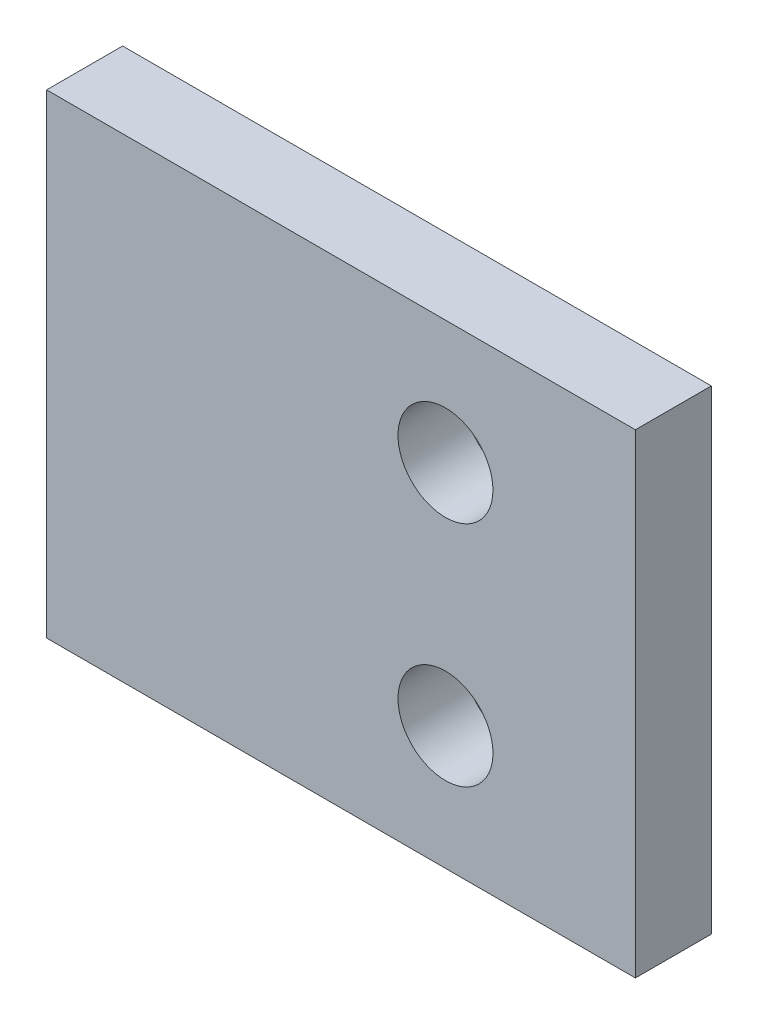
ISO-10303-21;
HEADER;
FILE_DESCRIPTION(('STEP AP214'),'2;1');
FILE_NAME('part.step','',(''),(''),'','','');
FILE_SCHEMA(('AUTOMOTIVE_DESIGN { 1 0 10303 214 1 1 1 1 }'));
ENDSEC;
DATA;
#1=APPLICATION_CONTEXT('core data for automotive mechanical design processes');
#2=APPLICATION_PROTOCOL_DEFINITION('international standard','automotive_design',2000,#1);
#3=PRODUCT_CONTEXT('',#1,'mechanical');
#4=PRODUCT('Part','Part','',(#3));
#5=PRODUCT_RELATED_PRODUCT_CATEGORY('part','',(#4));
#6=PRODUCT_DEFINITION_FORMATION('','',#4);
#7=PRODUCT_DEFINITION_CONTEXT('part definition',#1,'design');
#8=PRODUCT_DEFINITION('design','',#6,#7);
#9=PRODUCT_DEFINITION_SHAPE('','',#8);
#10=(LENGTH_UNIT() NAMED_UNIT(*) SI_UNIT(.MILLI.,.METRE.));
#11=(NAMED_UNIT(*) PLANE_ANGLE_UNIT() SI_UNIT($,.RADIAN.));
#12=(NAMED_UNIT(*) SI_UNIT($,.STERADIAN.) SOLID_ANGLE_UNIT());
#13=UNCERTAINTY_MEASURE_WITH_UNIT(LENGTH_MEASURE(1.E-05),#10,'distance_accuracy_value','');
#14=(GEOMETRIC_REPRESENTATION_CONTEXT(3) GLOBAL_UNCERTAINTY_ASSIGNED_CONTEXT((#13)) GLOBAL_UNIT_ASSIGNED_CONTEXT((#10,
#11,#12)) REPRESENTATION_CONTEXT('',''));
#15=CARTESIAN_POINT('',(0.,0.,0.));
#16=DIRECTION('',(0.,0.,1.));
#17=DIRECTION('',(1.,0.,0.));
#18=AXIS2_PLACEMENT_3D('',#15,#16,#17);
#19=CARTESIAN_POINT('',(0.,0.,0.));
#20=DIRECTION('',(0.,0.,-1.));
#21=DIRECTION('',(-1.,0.,0.));
#22=AXIS2_PLACEMENT_3D('',#19,#20,#21);
#23=PLANE('',#22);
#24=DIRECTION('',(0.,1.,0.));
#25=VECTOR('',#24,1.);
#26=CARTESIAN_POINT('',(27.3248941679667,-0.629356762228447,0.));
#27=LINE('',#26,#25);
#28=CARTESIAN_POINT('',(27.3248941679667,-0.042349697795728,0.));
#29=VERTEX_POINT('',#28);
#30=CARTESIAN_POINT('',(27.3248941679667,0.0423496977956855,0.));
#31=VERTEX_POINT('',#30);
#32=EDGE_CURVE('E135',#29,#31,#27,.T.);
#33=ORIENTED_EDGE('',*,*,#32,.F.);
#34=CARTESIAN_POINT('',(26.3248941679667,-0.042349697795728,0.));
#35=DIRECTION('',(0.,0.,-1.));
#36=DIRECTION('',(-1.,0.,0.));
#37=AXIS2_PLACEMENT_3D('',#34,#35,#36);
#38=CIRCLE('',#37,1.);
#39=CARTESIAN_POINT('',(26.8499092868286,-0.893442598110624,0.));
#40=VERTEX_POINT('',#39);
#41=EDGE_CURVE('E165',#29,#40,#38,.T.);
#42=ORIENTED_EDGE('',*,*,#41,.T.);
#43=CARTESIAN_POINT('',(30.,-6.,0.));
#44=DIRECTION('',(0.,0.,1.));
#45=DIRECTION('',(1.,0.,0.));
#46=AXIS2_PLACEMENT_3D('',#43,#44,#45);
#47=CIRCLE('',#46,6.);
#48=CARTESIAN_POINT('',(33.1758488368944,-0.909422020517059,0.));
#49=VERTEX_POINT('',#48);
#50=EDGE_CURVE('E211',#40,#49,#47,.T.);
#51=ORIENTED_EDGE('',*,*,#50,.T.);
#52=CARTESIAN_POINT('',(33.7051569763768,-0.0609923572699031,0.));
#53=DIRECTION('',(0.,0.,-1.));
#54=DIRECTION('',(-1.,0.,0.));
#55=AXIS2_PLACEMENT_3D('',#52,#53,#54);
#56=CIRCLE('',#55,1.);
#57=CARTESIAN_POINT('',(32.7051569763768,-0.0609923572699028,0.));
#58=VERTEX_POINT('',#57);
#59=EDGE_CURVE('E161',#49,#58,#56,.T.);
#60=ORIENTED_EDGE('',*,*,#59,.T.);
#61=DIRECTION('',(0.,-1.,0.));
#62=VECTOR('',#61,1.);
#63=CARTESIAN_POINT('',(32.7051569763768,0.64443040068,0.));
#64=LINE('',#63,#62);
#65=CARTESIAN_POINT('',(32.7051569763768,0.0609923572698521,0.));
#66=VERTEX_POINT('',#65);
#67=EDGE_CURVE('E206',#66,#58,#64,.T.);
#68=ORIENTED_EDGE('',*,*,#67,.F.);
#69=CARTESIAN_POINT('',(33.7051569763768,0.0609923572698519,0.));
#70=DIRECTION('',(0.,0.,-1.));
#71=DIRECTION('',(-1.,0.,0.));
#72=AXIS2_PLACEMENT_3D('',#69,#70,#71);
#73=CIRCLE('',#72,1.);
#74=CARTESIAN_POINT('',(33.1758488368944,0.909422020517008,0.));
#75=VERTEX_POINT('',#74);
#76=EDGE_CURVE('E159',#66,#75,#73,.T.);
#77=ORIENTED_EDGE('',*,*,#76,.T.);
#78=CARTESIAN_POINT('',(30.,5.99999999999996,0.));
#79=DIRECTION('',(0.,0.,1.));
#80=DIRECTION('',(1.,0.,0.));
#81=AXIS2_PLACEMENT_3D('',#78,#79,#80);
#82=CIRCLE('',#81,6.);
#83=CARTESIAN_POINT('',(26.8499092868286,0.893442598110581,0.));
#84=VERTEX_POINT('',#83);
#85=EDGE_CURVE('E205',#75,#84,#82,.T.);
#86=ORIENTED_EDGE('',*,*,#85,.T.);
#87=CARTESIAN_POINT('',(26.3248941679667,0.0423496977956855,0.));
#88=DIRECTION('',(0.,0.,-1.));
#89=DIRECTION('',(-1.,0.,0.));
#90=AXIS2_PLACEMENT_3D('',#87,#88,#89);
#91=CIRCLE('',#90,1.);
#92=EDGE_CURVE('E163',#84,#31,#91,.T.);
#93=ORIENTED_EDGE('',*,*,#92,.T.);
#94=EDGE_LOOP('',(#33,#42,#51,#60,#68,#77,#86,#93));
#95=FACE_BOUND('',#94,.T.);
#96=DIRECTION('',(1.,0.,0.));
#97=VECTOR('',#96,1.);
#98=CARTESIAN_POINT('',(-20.,-12.5,0.));
#99=LINE('',#98,#97);
#100=CARTESIAN_POINT('',(9.00000000000001,-12.5,0.));
#101=VERTEX_POINT('',#100);
#102=CARTESIAN_POINT('',(40.,-12.5,0.));
#103=VERTEX_POINT('',#102);
#104=EDGE_CURVE('E132',#101,#103,#99,.T.);
#105=ORIENTED_EDGE('',*,*,#104,.F.);
#106=DIRECTION('',(0.,1.,0.));
#107=VECTOR('',#106,1.);
#108=CARTESIAN_POINT('',(9.00000000000001,12.5,0.));
#109=LINE('',#108,#107);
#110=CARTESIAN_POINT('',(9.00000000000001,12.5,0.));
#111=VERTEX_POINT('',#110);
#112=EDGE_CURVE('E120',#101,#111,#109,.T.);
#113=ORIENTED_EDGE('',*,*,#112,.T.);
#114=DIRECTION('',(-1.,0.,0.));
#115=VECTOR('',#114,1.);
#116=CARTESIAN_POINT('',(-20.,12.5,0.));
#117=LINE('',#116,#115);
#118=CARTESIAN_POINT('',(40.,12.5,0.));
#119=VERTEX_POINT('',#118);
#120=EDGE_CURVE('E141',#119,#111,#117,.T.);
#121=ORIENTED_EDGE('',*,*,#120,.F.);
#122=DIRECTION('',(0.,1.,0.));
#123=VECTOR('',#122,1.);
#124=CARTESIAN_POINT('',(40.,12.5,0.));
#125=LINE('',#124,#123);
#126=EDGE_CURVE('E139',#103,#119,#125,.T.);
#127=ORIENTED_EDGE('',*,*,#126,.F.);
#128=EDGE_LOOP('',(#105,#113,#121,#127));
#129=FACE_BOUND('',#128,.T.);
#130=ADVANCED_FACE('F32',(#95,#129),#23,.T.);
#131=CARTESIAN_POINT('',(-20.,12.5,4.));
#132=DIRECTION('',(0.,-1.,0.));
#133=DIRECTION('',(0.,0.,-1.));
#134=AXIS2_PLACEMENT_3D('',#131,#132,#133);
#135=PLANE('',#134);
#136=DIRECTION('',(0.,0.,-1.));
#137=VECTOR('',#136,1.);
#138=CARTESIAN_POINT('',(9.00000000000001,12.5,10.));
#139=LINE('',#138,#137);
#140=CARTESIAN_POINT('',(9.00000000000001,12.5,4.));
#141=VERTEX_POINT('',#140);
#142=EDGE_CURVE('E123',#141,#111,#139,.T.);
#143=ORIENTED_EDGE('',*,*,#142,.F.);
#144=DIRECTION('',(-1.,0.,0.));
#145=VECTOR('',#144,1.);
#146=CARTESIAN_POINT('',(-20.,12.5,4.));
#147=LINE('',#146,#145);
#148=CARTESIAN_POINT('',(40.,12.5,4.));
#149=VERTEX_POINT('',#148);
#150=EDGE_CURVE('E140',#149,#141,#147,.T.);
#151=ORIENTED_EDGE('',*,*,#150,.F.);
#152=DIRECTION('',(0.,0.,-1.));
#153=VECTOR('',#152,1.);
#154=CARTESIAN_POINT('',(40.,12.5,4.));
#155=LINE('',#154,#153);
#156=EDGE_CURVE('E231',#149,#119,#155,.T.);
#157=ORIENTED_EDGE('',*,*,#156,.T.);
#158=ORIENTED_EDGE('',*,*,#120,.T.);
#159=EDGE_LOOP('',(#143,#151,#157,#158));
#160=FACE_BOUND('',#159,.T.);
#161=ADVANCED_FACE('F242',(#160),#135,.F.);
#162=CARTESIAN_POINT('',(-20.,-12.5,4.));
#163=DIRECTION('',(0.,1.,0.));
#164=DIRECTION('',(0.,0.,1.));
#165=AXIS2_PLACEMENT_3D('',#162,#163,#164);
#166=PLANE('',#165);
#167=DIRECTION('',(0.,0.,-1.));
#168=VECTOR('',#167,1.);
#169=CARTESIAN_POINT('',(9.00000000000001,-12.5,10.));
#170=LINE('',#169,#168);
#171=CARTESIAN_POINT('',(9.00000000000001,-12.5,4.));
#172=VERTEX_POINT('',#171);
#173=EDGE_CURVE('E46',#172,#101,#170,.T.);
#174=ORIENTED_EDGE('',*,*,#173,.T.);
#175=ORIENTED_EDGE('',*,*,#104,.T.);
#176=DIRECTION('',(0.,0.,-1.));
#177=VECTOR('',#176,1.);
#178=CARTESIAN_POINT('',(40.,-12.5,4.));
#179=LINE('',#178,#177);
#180=CARTESIAN_POINT('',(40.,-12.5,4.));
#181=VERTEX_POINT('',#180);
#182=EDGE_CURVE('E145',#181,#103,#179,.T.);
#183=ORIENTED_EDGE('',*,*,#182,.F.);
#184=DIRECTION('',(1.,0.,0.));
#185=VECTOR('',#184,1.);
#186=CARTESIAN_POINT('',(-20.,-12.5,4.));
#187=LINE('',#186,#185);
#188=EDGE_CURVE('E134',#172,#181,#187,.T.);
#189=ORIENTED_EDGE('',*,*,#188,.F.);
#190=EDGE_LOOP('',(#174,#175,#183,#189));
#191=FACE_BOUND('',#190,.T.);
#192=ADVANCED_FACE('F130',(#191),#166,.F.);
#193=CARTESIAN_POINT('',(0.,0.,4.));
#194=DIRECTION('',(0.,0.,-1.));
#195=DIRECTION('',(-1.,0.,0.));
#196=AXIS2_PLACEMENT_3D('',#193,#194,#195);
#197=PLANE('',#196);
#198=CARTESIAN_POINT('',(30.,-6.,4.));
#199=DIRECTION('',(0.,0.,1.));
#200=DIRECTION('',(-1.,0.,0.));
#201=AXIS2_PLACEMENT_3D('',#198,#199,#200);
#202=CIRCLE('',#201,2.5);
#203=CARTESIAN_POINT('',(27.5,-6.,4.));
#204=VERTEX_POINT('',#203);
#205=EDGE_CURVE('E222',#204,#204,#202,.T.);
#206=ORIENTED_EDGE('',*,*,#205,.F.);
#207=EDGE_LOOP('',(#206));
#208=FACE_BOUND('',#207,.T.);
#209=CARTESIAN_POINT('',(30.,5.99999999999996,4.));
#210=DIRECTION('',(0.,0.,1.));
#211=DIRECTION('',(1.,0.,0.));
#212=AXIS2_PLACEMENT_3D('',#209,#210,#211);
#213=CIRCLE('',#212,2.5);
#214=CARTESIAN_POINT('',(32.5,5.99999999999996,4.));
#215=VERTEX_POINT('',#214);
#216=EDGE_CURVE('E223',#215,#215,#213,.T.);
#217=ORIENTED_EDGE('',*,*,#216,.F.);
#218=EDGE_LOOP('',(#217));
#219=FACE_BOUND('',#218,.T.);
#220=DIRECTION('',(0.,1.,0.));
#221=VECTOR('',#220,1.);
#222=CARTESIAN_POINT('',(9.00000000000001,0.,4.));
#223=LINE('',#222,#221);
#224=EDGE_CURVE('E11',#172,#141,#223,.T.);
#225=ORIENTED_EDGE('',*,*,#224,.F.);
#226=ORIENTED_EDGE('',*,*,#188,.T.);
#227=DIRECTION('',(0.,1.,0.));
#228=VECTOR('',#227,1.);
#229=CARTESIAN_POINT('',(40.,12.5,4.));
#230=LINE('',#229,#228);
#231=EDGE_CURVE('E228',#181,#149,#230,.T.);
#232=ORIENTED_EDGE('',*,*,#231,.T.);
#233=ORIENTED_EDGE('',*,*,#150,.T.);
#234=EDGE_LOOP('',(#225,#226,#232,#233));
#235=FACE_BOUND('',#234,.T.);
#236=ADVANCED_FACE('F236',(#208,#219,#235),#197,.F.);
#237=CARTESIAN_POINT('',(40.,12.5,4.));
#238=DIRECTION('',(-1.,0.,0.));
#239=DIRECTION('',(0.,0.,1.));
#240=AXIS2_PLACEMENT_3D('',#237,#238,#239);
#241=PLANE('',#240);
#242=ORIENTED_EDGE('',*,*,#126,.T.);
#243=ORIENTED_EDGE('',*,*,#156,.F.);
#244=ORIENTED_EDGE('',*,*,#231,.F.);
#245=ORIENTED_EDGE('',*,*,#182,.T.);
#246=EDGE_LOOP('',(#242,#243,#244,#245));
#247=FACE_BOUND('',#246,.T.);
#248=ADVANCED_FACE('F240',(#247),#241,.F.);
#249=CARTESIAN_POINT('',(30.,-6.,4.));
#250=DIRECTION('',(0.,0.,-1.));
#251=DIRECTION('',(-1.,0.,0.));
#252=AXIS2_PLACEMENT_3D('',#249,#250,#251);
#253=CYLINDRICAL_SURFACE('',#252,2.5);
#254=CARTESIAN_POINT('',(30.,-6.,0.5));
#255=DIRECTION('',(0.,0.,1.));
#256=DIRECTION('',(1.,0.,0.));
#257=AXIS2_PLACEMENT_3D('',#254,#255,#256);
#258=CIRCLE('',#257,2.5);
#259=CARTESIAN_POINT('',(32.5,-6.,0.5));
#260=VERTEX_POINT('',#259);
#261=EDGE_CURVE('E152',#260,#260,#258,.T.);
#262=ORIENTED_EDGE('',*,*,#261,.F.);
#263=EDGE_LOOP('',(#262));
#264=FACE_BOUND('',#263,.T.);
#265=ORIENTED_EDGE('',*,*,#205,.T.);
#266=EDGE_LOOP('',(#265));
#267=FACE_BOUND('',#266,.T.);
#268=ADVANCED_FACE('F290',(#264,#267),#253,.F.);
#269=CARTESIAN_POINT('',(30.,5.99999999999996,4.));
#270=DIRECTION('',(0.,0.,-1.));
#271=DIRECTION('',(-1.,0.,0.));
#272=AXIS2_PLACEMENT_3D('',#269,#270,#271);
#273=CYLINDRICAL_SURFACE('',#272,2.5);
#274=CARTESIAN_POINT('',(30.,5.99999999999996,0.5));
#275=DIRECTION('',(0.,0.,1.));
#276=DIRECTION('',(1.,0.,0.));
#277=AXIS2_PLACEMENT_3D('',#274,#275,#276);
#278=CIRCLE('',#277,2.5);
#279=CARTESIAN_POINT('',(32.5,5.99999999999996,0.5));
#280=VERTEX_POINT('',#279);
#281=EDGE_CURVE('E149',#280,#280,#278,.T.);
#282=ORIENTED_EDGE('',*,*,#281,.F.);
#283=EDGE_LOOP('',(#282));
#284=FACE_BOUND('',#283,.T.);
#285=ORIENTED_EDGE('',*,*,#216,.T.);
#286=EDGE_LOOP('',(#285));
#287=FACE_BOUND('',#286,.T.);
#288=ADVANCED_FACE('F295',(#284,#287),#273,.F.);
#289=CARTESIAN_POINT('',(27.3248941679667,-0.629356762228447,0.5));
#290=DIRECTION('',(-1.,0.,0.));
#291=DIRECTION('',(0.,0.,1.));
#292=AXIS2_PLACEMENT_3D('',#289,#290,#291);
#293=PLANE('',#292);
#294=DIRECTION('',(0.,1.,0.));
#295=VECTOR('',#294,1.);
#296=CARTESIAN_POINT('',(27.3248941679667,-0.629356762228447,0.5));
#297=LINE('',#296,#295);
#298=CARTESIAN_POINT('',(27.3248941679667,-0.042349697795728,0.5));
#299=VERTEX_POINT('',#298);
#300=CARTESIAN_POINT('',(27.3248941679667,0.0423496977956855,0.5));
#301=VERTEX_POINT('',#300);
#302=EDGE_CURVE('E219',#299,#301,#297,.T.);
#303=ORIENTED_EDGE('',*,*,#302,.F.);
#304=DIRECTION('',(0.,0.,1.));
#305=VECTOR('',#304,1.);
#306=CARTESIAN_POINT('',(27.3248941679667,-0.042349697795728,0.));
#307=LINE('',#306,#305);
#308=EDGE_CURVE('E156',#299,#29,#307,.F.);
#309=ORIENTED_EDGE('',*,*,#308,.T.);
#310=ORIENTED_EDGE('',*,*,#32,.T.);
#311=DIRECTION('',(0.,0.,1.));
#312=VECTOR('',#311,1.);
#313=CARTESIAN_POINT('',(27.3248941679667,0.0423496977956855,0.5));
#314=LINE('',#313,#312);
#315=EDGE_CURVE('E154',#31,#301,#314,.T.);
#316=ORIENTED_EDGE('',*,*,#315,.T.);
#317=EDGE_LOOP('',(#303,#309,#310,#316));
#318=FACE_BOUND('',#317,.T.);
#319=ADVANCED_FACE('F262',(#318),#293,.F.);
#320=CARTESIAN_POINT('',(30.,-6.,0.5));
#321=DIRECTION('',(0.,0.,-1.));
#322=DIRECTION('',(-1.,0.,0.));
#323=AXIS2_PLACEMENT_3D('',#320,#321,#322);
#324=CYLINDRICAL_SURFACE('',#323,6.);
#325=ORIENTED_EDGE('',*,*,#50,.F.);
#326=DIRECTION('',(0.,0.,-1.));
#327=VECTOR('',#326,1.);
#328=CARTESIAN_POINT('',(26.8499092868286,-0.893442598110624,0.5));
#329=LINE('',#328,#327);
#330=CARTESIAN_POINT('',(26.8499092868286,-0.893442598110624,0.5));
#331=VERTEX_POINT('',#330);
#332=EDGE_CURVE('E170',#40,#331,#329,.F.);
#333=ORIENTED_EDGE('',*,*,#332,.T.);
#334=CARTESIAN_POINT('',(30.,-6.,0.5));
#335=DIRECTION('',(0.,0.,1.));
#336=DIRECTION('',(1.,0.,0.));
#337=AXIS2_PLACEMENT_3D('',#334,#335,#336);
#338=CIRCLE('',#337,6.);
#339=CARTESIAN_POINT('',(33.1758488368944,-0.909422020517059,0.5));
#340=VERTEX_POINT('',#339);
#341=EDGE_CURVE('E153',#331,#340,#338,.T.);
#342=ORIENTED_EDGE('',*,*,#341,.T.);
#343=DIRECTION('',(0.,0.,-1.));
#344=VECTOR('',#343,1.);
#345=CARTESIAN_POINT('',(33.1758488368944,-0.909422020517059,0.5));
#346=LINE('',#345,#344);
#347=EDGE_CURVE('E167',#340,#49,#346,.T.);
#348=ORIENTED_EDGE('',*,*,#347,.T.);
#349=EDGE_LOOP('',(#325,#333,#342,#348));
#350=FACE_BOUND('',#349,.T.);
#351=ADVANCED_FACE('F251',(#350),#324,.F.);
#352=CARTESIAN_POINT('',(32.7051569763768,0.64443040068,0.5));
#353=DIRECTION('',(1.,0.,0.));
#354=DIRECTION('',(0.,0.,-1.));
#355=AXIS2_PLACEMENT_3D('',#352,#353,#354);
#356=PLANE('',#355);
#357=ORIENTED_EDGE('',*,*,#67,.T.);
#358=DIRECTION('',(0.,0.,1.));
#359=VECTOR('',#358,1.);
#360=CARTESIAN_POINT('',(32.7051569763768,-0.0609923572699031,0.5));
#361=LINE('',#360,#359);
#362=CARTESIAN_POINT('',(32.7051569763768,-0.0609923572699028,0.5));
#363=VERTEX_POINT('',#362);
#364=EDGE_CURVE('E54',#58,#363,#361,.T.);
#365=ORIENTED_EDGE('',*,*,#364,.T.);
#366=DIRECTION('',(0.,-1.,0.));
#367=VECTOR('',#366,1.);
#368=CARTESIAN_POINT('',(32.7051569763768,0.64443040068,0.5));
#369=LINE('',#368,#367);
#370=CARTESIAN_POINT('',(32.7051569763768,0.0609923572698521,0.5));
#371=VERTEX_POINT('',#370);
#372=EDGE_CURVE('E191',#371,#363,#369,.T.);
#373=ORIENTED_EDGE('',*,*,#372,.F.);
#374=DIRECTION('',(0.,0.,1.));
#375=VECTOR('',#374,1.);
#376=CARTESIAN_POINT('',(32.7051569763768,0.0609923572698519,0.));
#377=LINE('',#376,#375);
#378=EDGE_CURVE('E177',#371,#66,#377,.F.);
#379=ORIENTED_EDGE('',*,*,#378,.T.);
#380=EDGE_LOOP('',(#357,#365,#373,#379));
#381=FACE_BOUND('',#380,.T.);
#382=ADVANCED_FACE('F198',(#381),#356,.F.);
#383=CARTESIAN_POINT('',(30.,5.99999999999996,0.5));
#384=DIRECTION('',(0.,0.,-1.));
#385=DIRECTION('',(-1.,0.,0.));
#386=AXIS2_PLACEMENT_3D('',#383,#384,#385);
#387=CYLINDRICAL_SURFACE('',#386,6.);
#388=CARTESIAN_POINT('',(30.,5.99999999999996,0.5));
#389=DIRECTION('',(0.,0.,1.));
#390=DIRECTION('',(1.,0.,0.));
#391=AXIS2_PLACEMENT_3D('',#388,#389,#390);
#392=CIRCLE('',#391,6.);
#393=CARTESIAN_POINT('',(33.1758488368944,0.909422020517008,0.5));
#394=VERTEX_POINT('',#393);
#395=CARTESIAN_POINT('',(26.8499092868286,0.893442598110581,0.5));
#396=VERTEX_POINT('',#395);
#397=EDGE_CURVE('E194',#394,#396,#392,.T.);
#398=ORIENTED_EDGE('',*,*,#397,.T.);
#399=DIRECTION('',(0.,0.,-1.));
#400=VECTOR('',#399,1.);
#401=CARTESIAN_POINT('',(26.8499092868286,0.893442598110581,0.5));
#402=LINE('',#401,#400);
#403=EDGE_CURVE('E174',#396,#84,#402,.T.);
#404=ORIENTED_EDGE('',*,*,#403,.T.);
#405=ORIENTED_EDGE('',*,*,#85,.F.);
#406=DIRECTION('',(0.,0.,-1.));
#407=VECTOR('',#406,1.);
#408=CARTESIAN_POINT('',(33.1758488368944,0.909422020517008,0.5));
#409=LINE('',#408,#407);
#410=EDGE_CURVE('E172',#75,#394,#409,.F.);
#411=ORIENTED_EDGE('',*,*,#410,.T.);
#412=EDGE_LOOP('',(#398,#404,#405,#411));
#413=FACE_BOUND('',#412,.T.);
#414=ADVANCED_FACE('F208',(#413),#387,.F.);
#415=CARTESIAN_POINT('',(30.,5.99999999999996,0.5));
#416=DIRECTION('',(0.,0.,1.));
#417=DIRECTION('',(1.,0.,0.));
#418=AXIS2_PLACEMENT_3D('',#415,#416,#417);
#419=PLANE('',#418);
#420=ORIENTED_EDGE('',*,*,#261,.T.);
#421=EDGE_LOOP('',(#420));
#422=FACE_BOUND('',#421,.T.);
#423=ORIENTED_EDGE('',*,*,#281,.T.);
#424=EDGE_LOOP('',(#423));
#425=FACE_BOUND('',#424,.T.);
#426=ORIENTED_EDGE('',*,*,#341,.F.);
#427=CARTESIAN_POINT('',(26.3248941679667,-0.042349697795728,0.5));
#428=DIRECTION('',(0.,0.,1.));
#429=DIRECTION('',(1.,0.,0.));
#430=AXIS2_PLACEMENT_3D('',#427,#428,#429);
#431=CIRCLE('',#430,1.);
#432=EDGE_CURVE('E181',#331,#299,#431,.T.);
#433=ORIENTED_EDGE('',*,*,#432,.T.);
#434=ORIENTED_EDGE('',*,*,#302,.T.);
#435=CARTESIAN_POINT('',(26.3248941679667,0.0423496977956855,0.5));
#436=DIRECTION('',(0.,0.,1.));
#437=DIRECTION('',(1.,0.,0.));
#438=AXIS2_PLACEMENT_3D('',#435,#436,#437);
#439=CIRCLE('',#438,1.);
#440=EDGE_CURVE('E183',#301,#396,#439,.T.);
#441=ORIENTED_EDGE('',*,*,#440,.T.);
#442=ORIENTED_EDGE('',*,*,#397,.F.);
#443=CARTESIAN_POINT('',(33.7051569763768,0.0609923572698519,0.5));
#444=DIRECTION('',(0.,0.,1.));
#445=DIRECTION('',(1.,0.,0.));
#446=AXIS2_PLACEMENT_3D('',#443,#444,#445);
#447=CIRCLE('',#446,1.);
#448=EDGE_CURVE('E40',#394,#371,#447,.T.);
#449=ORIENTED_EDGE('',*,*,#448,.T.);
#450=ORIENTED_EDGE('',*,*,#372,.T.);
#451=CARTESIAN_POINT('',(33.7051569763768,-0.0609923572699031,0.5));
#452=DIRECTION('',(0.,0.,1.));
#453=DIRECTION('',(1.,0.,0.));
#454=AXIS2_PLACEMENT_3D('',#451,#452,#453);
#455=CIRCLE('',#454,1.);
#456=EDGE_CURVE('E185',#363,#340,#455,.T.);
#457=ORIENTED_EDGE('',*,*,#456,.T.);
#458=EDGE_LOOP('',(#426,#433,#434,#441,#442,#449,#450,#457));
#459=FACE_BOUND('',#458,.T.);
#460=ADVANCED_FACE('F190',(#422,#425,#459),#419,.F.);
#461=CARTESIAN_POINT('',(26.3248941679667,-0.042349697795728,0.5));
#462=DIRECTION('',(0.,0.,-1.));
#463=DIRECTION('',(-1.,0.,0.));
#464=AXIS2_PLACEMENT_3D('',#461,#462,#463);
#465=CYLINDRICAL_SURFACE('',#464,1.);
#466=ORIENTED_EDGE('',*,*,#432,.F.);
#467=ORIENTED_EDGE('',*,*,#332,.F.);
#468=ORIENTED_EDGE('',*,*,#41,.F.);
#469=ORIENTED_EDGE('',*,*,#308,.F.);
#470=EDGE_LOOP('',(#466,#467,#468,#469));
#471=FACE_BOUND('',#470,.T.);
#472=ADVANCED_FACE('F257',(#471),#465,.T.);
#473=CARTESIAN_POINT('',(26.3248941679667,0.0423496977956855,0.5));
#474=DIRECTION('',(0.,0.,-1.));
#475=DIRECTION('',(-1.,0.,0.));
#476=AXIS2_PLACEMENT_3D('',#473,#474,#475);
#477=CYLINDRICAL_SURFACE('',#476,1.);
#478=ORIENTED_EDGE('',*,*,#440,.F.);
#479=ORIENTED_EDGE('',*,*,#315,.F.);
#480=ORIENTED_EDGE('',*,*,#92,.F.);
#481=ORIENTED_EDGE('',*,*,#403,.F.);
#482=EDGE_LOOP('',(#478,#479,#480,#481));
#483=FACE_BOUND('',#482,.T.);
#484=ADVANCED_FACE('F265',(#483),#477,.T.);
#485=CARTESIAN_POINT('',(33.7051569763768,-0.0609923572699031,0.5));
#486=DIRECTION('',(0.,0.,-1.));
#487=DIRECTION('',(-1.,0.,0.));
#488=AXIS2_PLACEMENT_3D('',#485,#486,#487);
#489=CYLINDRICAL_SURFACE('',#488,1.);
#490=ORIENTED_EDGE('',*,*,#456,.F.);
#491=ORIENTED_EDGE('',*,*,#364,.F.);
#492=ORIENTED_EDGE('',*,*,#59,.F.);
#493=ORIENTED_EDGE('',*,*,#347,.F.);
#494=EDGE_LOOP('',(#490,#491,#492,#493));
#495=FACE_BOUND('',#494,.T.);
#496=ADVANCED_FACE('F255',(#495),#489,.T.);
#497=CARTESIAN_POINT('',(33.7051569763768,0.0609923572698519,0.5));
#498=DIRECTION('',(0.,0.,-1.));
#499=DIRECTION('',(-1.,0.,0.));
#500=AXIS2_PLACEMENT_3D('',#497,#498,#499);
#501=CYLINDRICAL_SURFACE('',#500,1.);
#502=ORIENTED_EDGE('',*,*,#448,.F.);
#503=ORIENTED_EDGE('',*,*,#410,.F.);
#504=ORIENTED_EDGE('',*,*,#76,.F.);
#505=ORIENTED_EDGE('',*,*,#378,.F.);
#506=EDGE_LOOP('',(#502,#503,#504,#505));
#507=FACE_BOUND('',#506,.T.);
#508=ADVANCED_FACE('F34',(#507),#501,.T.);
#509=CARTESIAN_POINT('',(9.00000000000001,12.5,10.));
#510=DIRECTION('',(-1.,0.,0.));
#511=DIRECTION('',(0.,0.,1.));
#512=AXIS2_PLACEMENT_3D('',#509,#510,#511);
#513=PLANE('',#512);
#514=ORIENTED_EDGE('',*,*,#224,.T.);
#515=ORIENTED_EDGE('',*,*,#142,.T.);
#516=ORIENTED_EDGE('',*,*,#112,.F.);
#517=ORIENTED_EDGE('',*,*,#173,.F.);
#518=EDGE_LOOP('',(#514,#515,#516,#517));
#519=FACE_BOUND('',#518,.T.);
#520=ADVANCED_FACE('F121',(#519),#513,.T.);
#521=CLOSED_SHELL('',(#130,#161,#192,#236,#248,#268,#288,#319,#351,#382,#414,#460,#472,#484,
#496,#508,#520));
#522=MANIFOLD_SOLID_BREP('B2',#521);
#523=ADVANCED_BREP_SHAPE_REPRESENTATION('',(#18,#522),#14);
#524=SHAPE_DEFINITION_REPRESENTATION(#9,#523);
ENDSEC;
END-ISO-10303-21;
